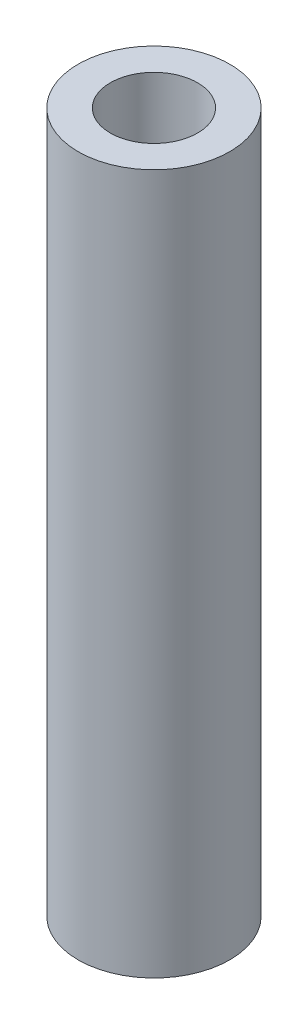
ISO-10303-21;
HEADER;
FILE_DESCRIPTION(('STEP AP214'),'2;1');
FILE_NAME('part.step','',(''),(''),'','','');
FILE_SCHEMA(('AUTOMOTIVE_DESIGN { 1 0 10303 214 1 1 1 1 }'));
ENDSEC;
DATA;
#1=APPLICATION_CONTEXT('core data for automotive mechanical design processes');
#2=APPLICATION_PROTOCOL_DEFINITION('international standard','automotive_design',2000,#1);
#3=PRODUCT_CONTEXT('',#1,'mechanical');
#4=PRODUCT('Part','Part','',(#3));
#5=PRODUCT_RELATED_PRODUCT_CATEGORY('part','',(#4));
#6=PRODUCT_DEFINITION_FORMATION('','',#4);
#7=PRODUCT_DEFINITION_CONTEXT('part definition',#1,'design');
#8=PRODUCT_DEFINITION('design','',#6,#7);
#9=PRODUCT_DEFINITION_SHAPE('','',#8);
#10=(LENGTH_UNIT() NAMED_UNIT(*) SI_UNIT(.MILLI.,.METRE.));
#11=(NAMED_UNIT(*) PLANE_ANGLE_UNIT() SI_UNIT($,.RADIAN.));
#12=(NAMED_UNIT(*) SI_UNIT($,.STERADIAN.) SOLID_ANGLE_UNIT());
#13=UNCERTAINTY_MEASURE_WITH_UNIT(LENGTH_MEASURE(1.E-05),#10,'distance_accuracy_value','');
#14=(GEOMETRIC_REPRESENTATION_CONTEXT(3) GLOBAL_UNCERTAINTY_ASSIGNED_CONTEXT((#13)) GLOBAL_UNIT_ASSIGNED_CONTEXT((#10,
#11,#12)) REPRESENTATION_CONTEXT('',''));
#15=CARTESIAN_POINT('',(0.,0.,0.));
#16=DIRECTION('',(0.,0.,1.));
#17=DIRECTION('',(1.,0.,0.));
#18=AXIS2_PLACEMENT_3D('',#15,#16,#17);
#19=CARTESIAN_POINT('',(0.,42.561585925838,0.));
#20=DIRECTION('',(0.,-1.,0.));
#21=DIRECTION('',(0.,0.,-1.));
#22=AXIS2_PLACEMENT_3D('',#19,#20,#21);
#23=CYLINDRICAL_SURFACE('',#22,5.65);
#24=CARTESIAN_POINT('',(0.,26.080972671022,0.));
#25=DIRECTION('',(0.,1.,0.));
#26=DIRECTION('',(0.,0.,1.));
#27=AXIS2_PLACEMENT_3D('',#24,#25,#26);
#28=CIRCLE('',#27,5.65);
#29=CARTESIAN_POINT('',(0.,26.080972671022,5.65));
#30=VERTEX_POINT('',#29);
#31=EDGE_CURVE('E11',#30,#30,#28,.T.);
#32=ORIENTED_EDGE('',*,*,#31,.F.);
#33=EDGE_LOOP('',(#32));
#34=FACE_BOUND('',#33,.T.);
#35=CARTESIAN_POINT('',(0.,-26.080972671022,0.));
#36=DIRECTION('',(0.,1.,0.));
#37=DIRECTION('',(0.,0.,1.));
#38=AXIS2_PLACEMENT_3D('',#35,#36,#37);
#39=CIRCLE('',#38,5.65);
#40=CARTESIAN_POINT('',(0.,-26.080972671022,5.65));
#41=VERTEX_POINT('',#40);
#42=EDGE_CURVE('E53',#41,#41,#39,.F.);
#43=ORIENTED_EDGE('',*,*,#42,.F.);
#44=EDGE_LOOP('',(#43));
#45=FACE_BOUND('',#44,.T.);
#46=ADVANCED_FACE('F39',(#34,#45),#23,.T.);
#47=CARTESIAN_POINT('',(0.,42.561585925838,0.));
#48=DIRECTION('',(0.,-1.,0.));
#49=DIRECTION('',(0.,0.,-1.));
#50=AXIS2_PLACEMENT_3D('',#47,#48,#49);
#51=CYLINDRICAL_SURFACE('',#50,3.25);
#52=CARTESIAN_POINT('',(0.,26.080972671022,0.));
#53=DIRECTION('',(0.,1.,0.));
#54=DIRECTION('',(0.,0.,1.));
#55=AXIS2_PLACEMENT_3D('',#52,#53,#54);
#56=CIRCLE('',#55,3.25);
#57=CARTESIAN_POINT('',(0.,26.080972671022,3.25));
#58=VERTEX_POINT('',#57);
#59=EDGE_CURVE('E42',#58,#58,#56,.T.);
#60=ORIENTED_EDGE('',*,*,#59,.T.);
#61=EDGE_LOOP('',(#60));
#62=FACE_BOUND('',#61,.T.);
#63=CARTESIAN_POINT('',(0.,-26.080972671022,0.));
#64=DIRECTION('',(0.,1.,0.));
#65=DIRECTION('',(0.,0.,1.));
#66=AXIS2_PLACEMENT_3D('',#63,#64,#65);
#67=CIRCLE('',#66,3.25);
#68=CARTESIAN_POINT('',(0.,-26.080972671022,3.25));
#69=VERTEX_POINT('',#68);
#70=EDGE_CURVE('E49',#69,#69,#67,.F.);
#71=ORIENTED_EDGE('',*,*,#70,.T.);
#72=EDGE_LOOP('',(#71));
#73=FACE_BOUND('',#72,.T.);
#74=ADVANCED_FACE('F61',(#62,#73),#51,.F.);
#75=CARTESIAN_POINT('',(0.,26.080972671022,-50.6999999999998));
#76=DIRECTION('',(0.,1.,0.));
#77=DIRECTION('',(0.,0.,1.));
#78=AXIS2_PLACEMENT_3D('',#75,#76,#77);
#79=PLANE('',#78);
#80=ORIENTED_EDGE('',*,*,#59,.F.);
#81=EDGE_LOOP('',(#80));
#82=FACE_BOUND('',#81,.T.);
#83=ORIENTED_EDGE('',*,*,#31,.T.);
#84=EDGE_LOOP('',(#83));
#85=FACE_BOUND('',#84,.T.);
#86=ADVANCED_FACE('F66',(#82,#85),#79,.T.);
#87=CARTESIAN_POINT('',(0.,-26.080972671022,-50.7000000000002));
#88=DIRECTION('',(0.,1.,0.));
#89=DIRECTION('',(0.,0.,1.));
#90=AXIS2_PLACEMENT_3D('',#87,#88,#89);
#91=PLANE('',#90);
#92=ORIENTED_EDGE('',*,*,#42,.T.);
#93=EDGE_LOOP('',(#92));
#94=FACE_BOUND('',#93,.T.);
#95=ORIENTED_EDGE('',*,*,#70,.F.);
#96=EDGE_LOOP('',(#95));
#97=FACE_BOUND('',#96,.T.);
#98=ADVANCED_FACE('F57',(#94,#97),#91,.F.);
#99=CLOSED_SHELL('',(#46,#74,#86,#98));
#100=MANIFOLD_SOLID_BREP('B2',#99);
#101=ADVANCED_BREP_SHAPE_REPRESENTATION('',(#18,#100),#14);
#102=SHAPE_DEFINITION_REPRESENTATION(#9,#101);
ENDSEC;
END-ISO-10303-21;
